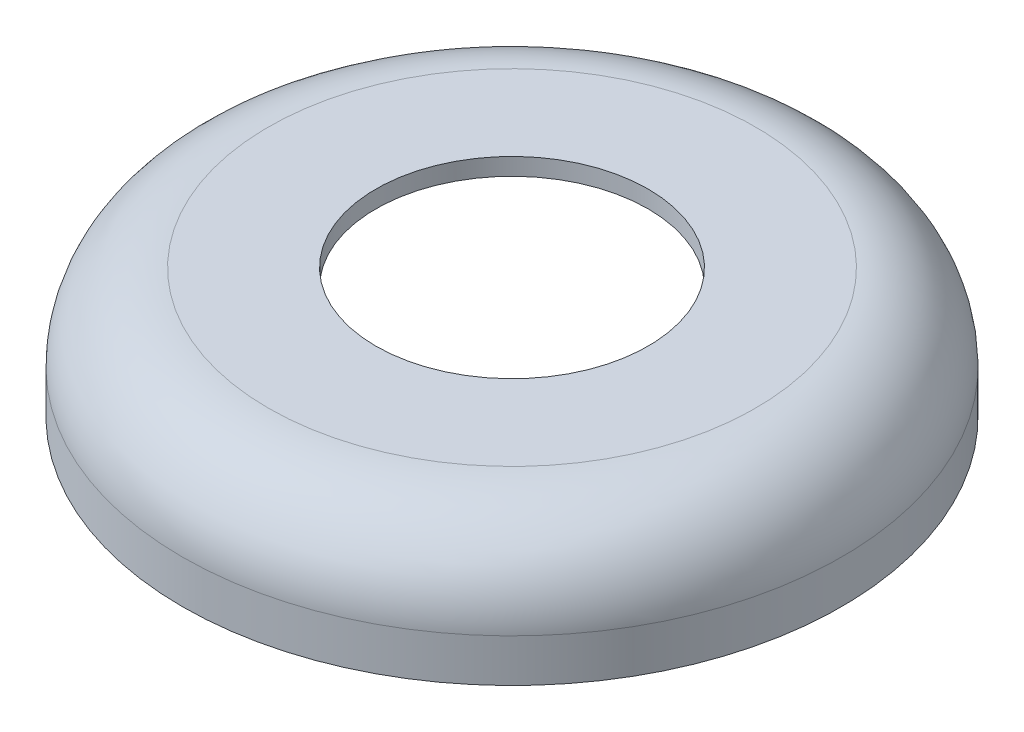
ISO-10303-21;
HEADER;
FILE_DESCRIPTION(('STEP AP214'),'2;1');
FILE_NAME('part.step','',(''),(''),'','','');
FILE_SCHEMA(('AUTOMOTIVE_DESIGN { 1 0 10303 214 1 1 1 1 }'));
ENDSEC;
DATA;
#1=APPLICATION_CONTEXT('core data for automotive mechanical design processes');
#2=APPLICATION_PROTOCOL_DEFINITION('international standard','automotive_design',2000,#1);
#3=PRODUCT_CONTEXT('',#1,'mechanical');
#4=PRODUCT('Part','Part','',(#3));
#5=PRODUCT_RELATED_PRODUCT_CATEGORY('part','',(#4));
#6=PRODUCT_DEFINITION_FORMATION('','',#4);
#7=PRODUCT_DEFINITION_CONTEXT('part definition',#1,'design');
#8=PRODUCT_DEFINITION('design','',#6,#7);
#9=PRODUCT_DEFINITION_SHAPE('','',#8);
#10=(LENGTH_UNIT() NAMED_UNIT(*) SI_UNIT(.MILLI.,.METRE.));
#11=(NAMED_UNIT(*) PLANE_ANGLE_UNIT() SI_UNIT($,.RADIAN.));
#12=(NAMED_UNIT(*) SI_UNIT($,.STERADIAN.) SOLID_ANGLE_UNIT());
#13=UNCERTAINTY_MEASURE_WITH_UNIT(LENGTH_MEASURE(1.E-05),#10,'distance_accuracy_value','');
#14=(GEOMETRIC_REPRESENTATION_CONTEXT(3) GLOBAL_UNCERTAINTY_ASSIGNED_CONTEXT((#13)) GLOBAL_UNIT_ASSIGNED_CONTEXT((#10,
#11,#12)) REPRESENTATION_CONTEXT('',''));
#15=CARTESIAN_POINT('',(0.,0.,0.));
#16=DIRECTION('',(0.,0.,1.));
#17=DIRECTION('',(1.,0.,0.));
#18=AXIS2_PLACEMENT_3D('',#15,#16,#17);
#19=CARTESIAN_POINT('',(0.,4.5,0.));
#20=DIRECTION('',(0.,-1.,0.));
#21=DIRECTION('',(0.,0.,-1.));
#22=AXIS2_PLACEMENT_3D('',#19,#20,#21);
#23=CYLINDRICAL_SURFACE('',#22,11.5);
#24=CARTESIAN_POINT('',(0.,1.5,0.));
#25=DIRECTION('',(0.,1.,0.));
#26=DIRECTION('',(0.,0.,1.));
#27=AXIS2_PLACEMENT_3D('',#24,#25,#26);
#28=CIRCLE('',#27,11.5);
#29=CARTESIAN_POINT('',(0.,1.5,11.5));
#30=VERTEX_POINT('',#29);
#31=EDGE_CURVE('E10',#30,#30,#28,.F.);
#32=ORIENTED_EDGE('',*,*,#31,.T.);
#33=EDGE_LOOP('',(#32));
#34=FACE_BOUND('',#33,.T.);
#35=CARTESIAN_POINT('',(0.,0.,0.));
#36=DIRECTION('',(0.,1.,0.));
#37=DIRECTION('',(0.,0.,1.));
#38=AXIS2_PLACEMENT_3D('',#35,#36,#37);
#39=CIRCLE('',#38,11.5);
#40=CARTESIAN_POINT('',(0.,0.,11.5));
#41=VERTEX_POINT('',#40);
#42=EDGE_CURVE('E48',#41,#41,#39,.T.);
#43=ORIENTED_EDGE('',*,*,#42,.T.);
#44=EDGE_LOOP('',(#43));
#45=FACE_BOUND('',#44,.T.);
#46=ADVANCED_FACE('F36',(#34,#45),#23,.T.);
#47=CARTESIAN_POINT('',(0.,4.5,0.));
#48=DIRECTION('',(0.,1.,0.));
#49=DIRECTION('',(0.,0.,1.));
#50=AXIS2_PLACEMENT_3D('',#47,#48,#49);
#51=PLANE('',#50);
#52=CARTESIAN_POINT('',(0.,4.5,0.));
#53=DIRECTION('',(0.,1.,0.));
#54=DIRECTION('',(0.,0.,1.));
#55=AXIS2_PLACEMENT_3D('',#52,#53,#54);
#56=CIRCLE('',#55,4.75);
#57=CARTESIAN_POINT('',(0.,4.5,4.75));
#58=VERTEX_POINT('',#57);
#59=EDGE_CURVE('E62',#58,#58,#56,.T.);
#60=ORIENTED_EDGE('',*,*,#59,.F.);
#61=EDGE_LOOP('',(#60));
#62=FACE_BOUND('',#61,.T.);
#63=CARTESIAN_POINT('',(0.,4.5,0.));
#64=DIRECTION('',(0.,1.,0.));
#65=DIRECTION('',(0.,0.,1.));
#66=AXIS2_PLACEMENT_3D('',#63,#64,#65);
#67=CIRCLE('',#66,8.5);
#68=CARTESIAN_POINT('',(0.,4.5,8.5));
#69=VERTEX_POINT('',#68);
#70=EDGE_CURVE('E44',#69,#69,#67,.T.);
#71=ORIENTED_EDGE('',*,*,#70,.T.);
#72=EDGE_LOOP('',(#71));
#73=FACE_BOUND('',#72,.T.);
#74=ADVANCED_FACE('F83',(#62,#73),#51,.T.);
#75=CARTESIAN_POINT('',(0.,0.,0.));
#76=DIRECTION('',(0.,1.,0.));
#77=DIRECTION('',(0.,0.,1.));
#78=AXIS2_PLACEMENT_3D('',#75,#76,#77);
#79=PLANE('',#78);
#80=CARTESIAN_POINT('',(0.,0.,0.));
#81=DIRECTION('',(0.,1.,0.));
#82=DIRECTION('',(0.,0.,1.));
#83=AXIS2_PLACEMENT_3D('',#80,#81,#82);
#84=CIRCLE('',#83,10.9);
#85=CARTESIAN_POINT('',(0.,0.,10.9));
#86=VERTEX_POINT('',#85);
#87=EDGE_CURVE('E54',#86,#86,#84,.T.);
#88=ORIENTED_EDGE('',*,*,#87,.T.);
#89=EDGE_LOOP('',(#88));
#90=FACE_BOUND('',#89,.T.);
#91=ORIENTED_EDGE('',*,*,#42,.F.);
#92=EDGE_LOOP('',(#91));
#93=FACE_BOUND('',#92,.T.);
#94=ADVANCED_FACE('F87',(#90,#93),#79,.F.);
#95=CARTESIAN_POINT('',(0.,1.5,0.));
#96=DIRECTION('',(0.,1.,0.));
#97=DIRECTION('',(0.,0.,1.));
#98=AXIS2_PLACEMENT_3D('',#95,#96,#97);
#99=TOROIDAL_SURFACE('',#98,8.5,3.);
#100=ORIENTED_EDGE('',*,*,#31,.F.);
#101=EDGE_LOOP('',(#100));
#102=FACE_BOUND('',#101,.T.);
#103=ORIENTED_EDGE('',*,*,#70,.F.);
#104=EDGE_LOOP('',(#103));
#105=FACE_BOUND('',#104,.T.);
#106=ADVANCED_FACE('F38',(#102,#105),#99,.T.);
#107=CARTESIAN_POINT('',(0.,4.5,0.));
#108=DIRECTION('',(0.,-1.,0.));
#109=DIRECTION('',(0.,0.,-1.));
#110=AXIS2_PLACEMENT_3D('',#107,#108,#109);
#111=CYLINDRICAL_SURFACE('',#110,10.9);
#112=CARTESIAN_POINT('',(0.,1.5,0.));
#113=DIRECTION('',(0.,-1.,0.));
#114=DIRECTION('',(0.,0.,-1.));
#115=AXIS2_PLACEMENT_3D('',#112,#113,#114);
#116=CIRCLE('',#115,10.9);
#117=CARTESIAN_POINT('',(0.,1.5,-10.9));
#118=VERTEX_POINT('',#117);
#119=EDGE_CURVE('E53',#118,#118,#116,.T.);
#120=ORIENTED_EDGE('',*,*,#119,.F.);
#121=EDGE_LOOP('',(#120));
#122=FACE_BOUND('',#121,.T.);
#123=ORIENTED_EDGE('',*,*,#87,.F.);
#124=EDGE_LOOP('',(#123));
#125=FACE_BOUND('',#124,.T.);
#126=ADVANCED_FACE('F96',(#122,#125),#111,.F.);
#127=CARTESIAN_POINT('',(0.,3.9,0.));
#128=DIRECTION('',(0.,1.,0.));
#129=DIRECTION('',(0.,0.,1.));
#130=AXIS2_PLACEMENT_3D('',#127,#128,#129);
#131=PLANE('',#130);
#132=CARTESIAN_POINT('',(0.,3.9,0.));
#133=DIRECTION('',(0.,1.,0.));
#134=DIRECTION('',(0.,0.,1.));
#135=AXIS2_PLACEMENT_3D('',#132,#133,#134);
#136=CIRCLE('',#135,4.75);
#137=CARTESIAN_POINT('',(0.,3.9,4.75));
#138=VERTEX_POINT('',#137);
#139=EDGE_CURVE('E40',#138,#138,#136,.T.);
#140=ORIENTED_EDGE('',*,*,#139,.T.);
#141=EDGE_LOOP('',(#140));
#142=FACE_BOUND('',#141,.T.);
#143=CARTESIAN_POINT('',(0.,3.9,0.));
#144=DIRECTION('',(0.,1.,0.));
#145=DIRECTION('',(0.,0.,1.));
#146=AXIS2_PLACEMENT_3D('',#143,#144,#145);
#147=CIRCLE('',#146,8.5);
#148=CARTESIAN_POINT('',(0.,3.9,8.5));
#149=VERTEX_POINT('',#148);
#150=EDGE_CURVE('E57',#149,#149,#147,.T.);
#151=ORIENTED_EDGE('',*,*,#150,.F.);
#152=EDGE_LOOP('',(#151));
#153=FACE_BOUND('',#152,.T.);
#154=ADVANCED_FACE('F69',(#142,#153),#131,.F.);
#155=CARTESIAN_POINT('',(0.,1.5,0.));
#156=DIRECTION('',(0.,1.,0.));
#157=DIRECTION('',(0.,0.,1.));
#158=AXIS2_PLACEMENT_3D('',#155,#156,#157);
#159=TOROIDAL_SURFACE('',#158,8.5,2.4);
#160=ORIENTED_EDGE('',*,*,#119,.T.);
#161=EDGE_LOOP('',(#160));
#162=FACE_BOUND('',#161,.T.);
#163=ORIENTED_EDGE('',*,*,#150,.T.);
#164=EDGE_LOOP('',(#163));
#165=FACE_BOUND('',#164,.T.);
#166=ADVANCED_FACE('F74',(#162,#165),#159,.F.);
#167=CARTESIAN_POINT('',(0.,0.,0.));
#168=DIRECTION('',(0.,1.,0.));
#169=DIRECTION('',(0.,0.,1.));
#170=AXIS2_PLACEMENT_3D('',#167,#168,#169);
#171=CYLINDRICAL_SURFACE('',#170,4.75);
#172=ORIENTED_EDGE('',*,*,#59,.T.);
#173=EDGE_LOOP('',(#172));
#174=FACE_BOUND('',#173,.T.);
#175=ORIENTED_EDGE('',*,*,#139,.F.);
#176=EDGE_LOOP('',(#175));
#177=FACE_BOUND('',#176,.T.);
#178=ADVANCED_FACE('F72',(#174,#177),#171,.F.);
#179=CLOSED_SHELL('',(#46,#74,#94,#106,#126,#154,#166,#178));
#180=MANIFOLD_SOLID_BREP('B2',#179);
#181=ADVANCED_BREP_SHAPE_REPRESENTATION('',(#18,#180),#14);
#182=SHAPE_DEFINITION_REPRESENTATION(#9,#181);
ENDSEC;
END-ISO-10303-21;
